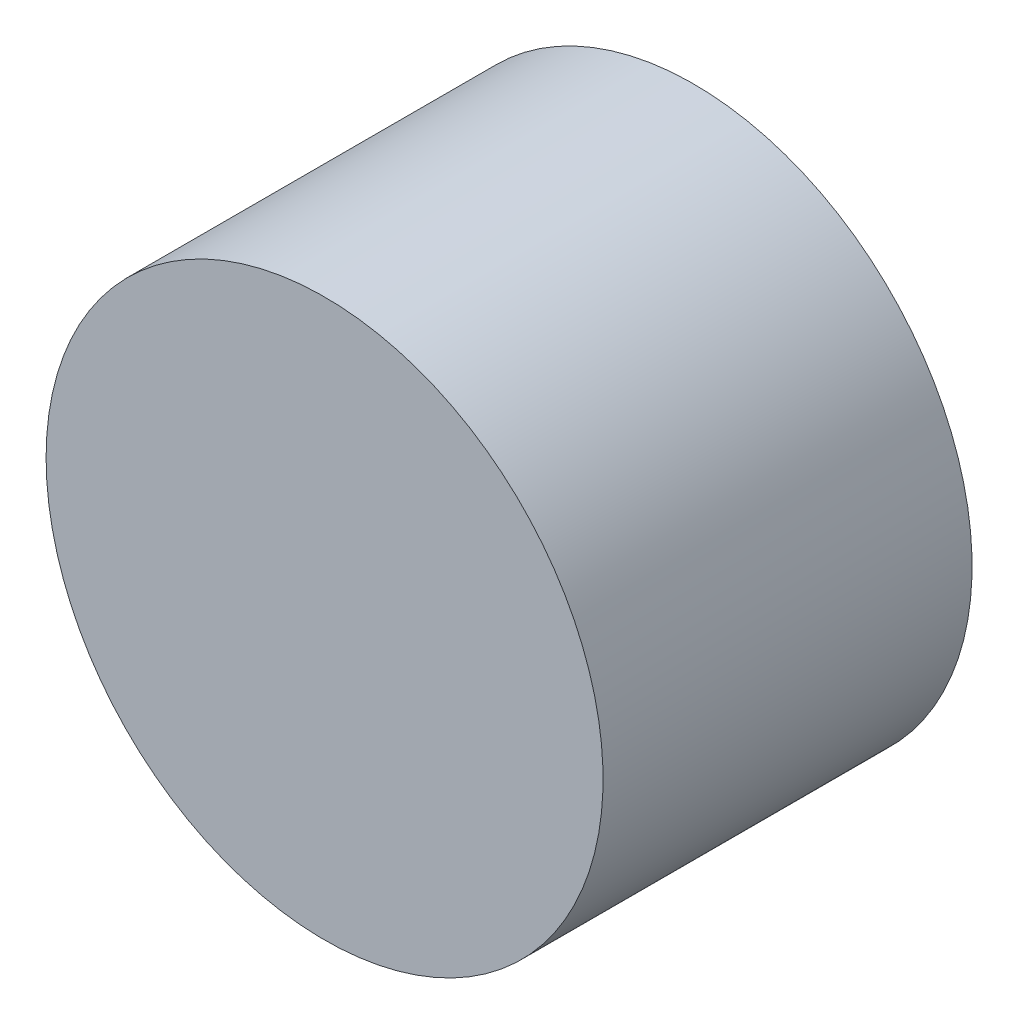
ISO-10303-21;
HEADER;
FILE_DESCRIPTION(('STEP AP214'),'2;1');
FILE_NAME('part.step','',(''),(''),'','','');
FILE_SCHEMA(('AUTOMOTIVE_DESIGN { 1 0 10303 214 1 1 1 1 }'));
ENDSEC;
DATA;
#1=APPLICATION_CONTEXT('core data for automotive mechanical design processes');
#2=APPLICATION_PROTOCOL_DEFINITION('international standard','automotive_design',2000,#1);
#3=PRODUCT_CONTEXT('',#1,'mechanical');
#4=PRODUCT('Part','Part','',(#3));
#5=PRODUCT_RELATED_PRODUCT_CATEGORY('part','',(#4));
#6=PRODUCT_DEFINITION_FORMATION('','',#4);
#7=PRODUCT_DEFINITION_CONTEXT('part definition',#1,'design');
#8=PRODUCT_DEFINITION('design','',#6,#7);
#9=PRODUCT_DEFINITION_SHAPE('','',#8);
#10=(LENGTH_UNIT() NAMED_UNIT(*) SI_UNIT(.MILLI.,.METRE.));
#11=(NAMED_UNIT(*) PLANE_ANGLE_UNIT() SI_UNIT($,.RADIAN.));
#12=(NAMED_UNIT(*) SI_UNIT($,.STERADIAN.) SOLID_ANGLE_UNIT());
#13=UNCERTAINTY_MEASURE_WITH_UNIT(LENGTH_MEASURE(1.E-05),#10,'distance_accuracy_value','');
#14=(GEOMETRIC_REPRESENTATION_CONTEXT(3) GLOBAL_UNCERTAINTY_ASSIGNED_CONTEXT((#13)) GLOBAL_UNIT_ASSIGNED_CONTEXT((#10,
#11,#12)) REPRESENTATION_CONTEXT('',''));
#15=CARTESIAN_POINT('',(0.,0.,0.));
#16=DIRECTION('',(0.,0.,1.));
#17=DIRECTION('',(1.,0.,0.));
#18=AXIS2_PLACEMENT_3D('',#15,#16,#17);
#19=CARTESIAN_POINT('',(2.99999908,0.,0.));
#20=DIRECTION('',(0.,0.,-1.));
#21=DIRECTION('',(-1.,0.,0.));
#22=AXIS2_PLACEMENT_3D('',#19,#20,#21);
#23=PLANE('',#22);
#24=CARTESIAN_POINT('',(0.,0.,0.));
#25=DIRECTION('',(0.,0.,-1.));
#26=DIRECTION('',(-1.,0.,0.));
#27=AXIS2_PLACEMENT_3D('',#24,#25,#26);
#28=CIRCLE('',#27,2.99999908);
#29=CARTESIAN_POINT('',(-2.99999908,0.,0.));
#30=VERTEX_POINT('',#29);
#31=EDGE_CURVE('E25',#30,#30,#28,.F.);
#32=ORIENTED_EDGE('',*,*,#31,.F.);
#33=EDGE_LOOP('',(#32));
#34=FACE_BOUND('',#33,.T.);
#35=ADVANCED_FACE('F22',(#34),#23,.T.);
#36=CARTESIAN_POINT('',(2.99999908,0.,3.97500094));
#37=DIRECTION('',(0.,0.,-1.));
#38=DIRECTION('',(-1.,0.,0.));
#39=AXIS2_PLACEMENT_3D('',#36,#37,#38);
#40=PLANE('',#39);
#41=CARTESIAN_POINT('',(0.,0.,3.97500094));
#42=DIRECTION('',(0.,0.,-1.));
#43=DIRECTION('',(-1.,0.,0.));
#44=AXIS2_PLACEMENT_3D('',#41,#42,#43);
#45=CIRCLE('',#44,2.99999908);
#46=CARTESIAN_POINT('',(-2.99999908,0.,3.97500094));
#47=VERTEX_POINT('',#46);
#48=EDGE_CURVE('E12',#47,#47,#45,.T.);
#49=ORIENTED_EDGE('',*,*,#48,.F.);
#50=EDGE_LOOP('',(#49));
#51=FACE_BOUND('',#50,.T.);
#52=ADVANCED_FACE('F37',(#51),#40,.F.);
#53=CARTESIAN_POINT('',(0.,0.,0.));
#54=DIRECTION('',(0.,0.,-1.));
#55=DIRECTION('',(-1.,0.,0.));
#56=AXIS2_PLACEMENT_3D('',#53,#54,#55);
#57=CYLINDRICAL_SURFACE('',#56,2.99999908);
#58=ORIENTED_EDGE('',*,*,#48,.T.);
#59=EDGE_LOOP('',(#58));
#60=FACE_BOUND('',#59,.T.);
#61=ORIENTED_EDGE('',*,*,#31,.T.);
#62=EDGE_LOOP('',(#61));
#63=FACE_BOUND('',#62,.T.);
#64=ADVANCED_FACE('F34',(#60,#63),#57,.T.);
#65=CLOSED_SHELL('',(#35,#52,#64));
#66=MANIFOLD_SOLID_BREP('B1',#65);
#67=ADVANCED_BREP_SHAPE_REPRESENTATION('',(#18,#66),#14);
#68=SHAPE_DEFINITION_REPRESENTATION(#9,#67);
ENDSEC;
END-ISO-10303-21;
